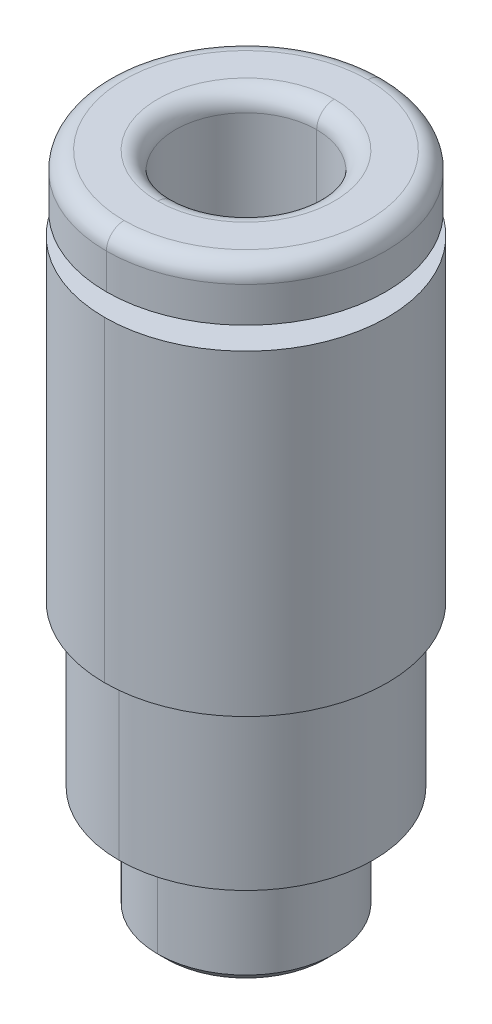
ISO-10303-21;
HEADER;
FILE_DESCRIPTION(('STEP AP214'),'2;1');
FILE_NAME('part.step','',(''),(''),'','','');
FILE_SCHEMA(('AUTOMOTIVE_DESIGN { 1 0 10303 214 1 1 1 1 }'));
ENDSEC;
DATA;
#1=APPLICATION_CONTEXT('core data for automotive mechanical design processes');
#2=APPLICATION_PROTOCOL_DEFINITION('international standard','automotive_design',2000,#1);
#3=PRODUCT_CONTEXT('',#1,'mechanical');
#4=PRODUCT('Part','Part','',(#3));
#5=PRODUCT_RELATED_PRODUCT_CATEGORY('part','',(#4));
#6=PRODUCT_DEFINITION_FORMATION('','',#4);
#7=PRODUCT_DEFINITION_CONTEXT('part definition',#1,'design');
#8=PRODUCT_DEFINITION('design','',#6,#7);
#9=PRODUCT_DEFINITION_SHAPE('','',#8);
#10=(LENGTH_UNIT() NAMED_UNIT(*) SI_UNIT(.MILLI.,.METRE.));
#11=(NAMED_UNIT(*) PLANE_ANGLE_UNIT() SI_UNIT($,.RADIAN.));
#12=(NAMED_UNIT(*) SI_UNIT($,.STERADIAN.) SOLID_ANGLE_UNIT());
#13=UNCERTAINTY_MEASURE_WITH_UNIT(LENGTH_MEASURE(1.E-05),#10,'distance_accuracy_value','');
#14=(GEOMETRIC_REPRESENTATION_CONTEXT(3) GLOBAL_UNCERTAINTY_ASSIGNED_CONTEXT((#13)) GLOBAL_UNIT_ASSIGNED_CONTEXT((#10,
#11,#12)) REPRESENTATION_CONTEXT('',''));
#15=CARTESIAN_POINT('',(0.,0.,0.));
#16=DIRECTION('',(0.,0.,1.));
#17=DIRECTION('',(1.,0.,0.));
#18=AXIS2_PLACEMENT_3D('',#15,#16,#17);
#19=CARTESIAN_POINT('',(0.,-18.7,0.));
#20=DIRECTION('',(0.,1.,0.));
#21=DIRECTION('',(0.,0.,1.));
#22=AXIS2_PLACEMENT_3D('',#19,#20,#21);
#23=CYLINDRICAL_SURFACE('',#22,1.1801584610165);
#24=CARTESIAN_POINT('',(0.,-18.7,0.));
#25=DIRECTION('',(0.,1.,0.));
#26=DIRECTION('',(0.,0.,1.));
#27=AXIS2_PLACEMENT_3D('',#24,#25,#26);
#28=CIRCLE('',#27,1.1801584610165);
#29=CARTESIAN_POINT('',(0.,-18.7,-1.1801584610165));
#30=VERTEX_POINT('',#29);
#31=CARTESIAN_POINT('',(0.,-18.7,1.1801584610165));
#32=VERTEX_POINT('',#31);
#33=EDGE_CURVE('E41',#30,#32,#28,.T.);
#34=ORIENTED_EDGE('',*,*,#33,.F.);
#35=DIRECTION('',(0.,1.,0.));
#36=VECTOR('',#35,1.);
#37=CARTESIAN_POINT('',(0.,-18.7,-1.1801584610165));
#38=LINE('',#37,#36);
#39=CARTESIAN_POINT('',(0.,-14.7,-1.1801584610165));
#40=VERTEX_POINT('',#39);
#41=EDGE_CURVE('E10',#30,#40,#38,.T.);
#42=ORIENTED_EDGE('',*,*,#41,.T.);
#43=CARTESIAN_POINT('',(0.,-14.7,0.));
#44=DIRECTION('',(0.,-1.,0.));
#45=DIRECTION('',(0.,0.,-1.));
#46=AXIS2_PLACEMENT_3D('',#43,#44,#45);
#47=CIRCLE('',#46,1.1801584610165);
#48=CARTESIAN_POINT('',(-1.02204720773144,-14.7,-0.590079230508252));
#49=VERTEX_POINT('',#48);
#50=EDGE_CURVE('E395',#49,#40,#47,.T.);
#51=ORIENTED_EDGE('',*,*,#50,.F.);
#52=CARTESIAN_POINT('',(0.,-14.7,0.));
#53=DIRECTION('',(0.,-1.,0.));
#54=DIRECTION('',(0.,0.,-1.));
#55=AXIS2_PLACEMENT_3D('',#52,#53,#54);
#56=CIRCLE('',#55,1.1801584610165);
#57=CARTESIAN_POINT('',(-1.02204720773144,-14.7,0.590079230508252));
#58=VERTEX_POINT('',#57);
#59=EDGE_CURVE('E274',#58,#49,#56,.T.);
#60=ORIENTED_EDGE('',*,*,#59,.F.);
#61=CARTESIAN_POINT('',(0.,-14.7,0.));
#62=DIRECTION('',(0.,-1.,0.));
#63=DIRECTION('',(0.,0.,-1.));
#64=AXIS2_PLACEMENT_3D('',#61,#62,#63);
#65=CIRCLE('',#64,1.1801584610165);
#66=CARTESIAN_POINT('',(0.,-14.7,1.1801584610165));
#67=VERTEX_POINT('',#66);
#68=EDGE_CURVE('E313',#67,#58,#65,.T.);
#69=ORIENTED_EDGE('',*,*,#68,.F.);
#70=DIRECTION('',(0.,1.,0.));
#71=VECTOR('',#70,1.);
#72=CARTESIAN_POINT('',(0.,-18.7,1.1801584610165));
#73=LINE('',#72,#71);
#74=EDGE_CURVE('E256',#32,#67,#73,.T.);
#75=ORIENTED_EDGE('',*,*,#74,.F.);
#76=EDGE_LOOP('',(#34,#42,#51,#60,#69,#75));
#77=FACE_BOUND('',#76,.T.);
#78=ADVANCED_FACE('F16',(#77),#23,.F.);
#79=CARTESIAN_POINT('',(0.,-0.5,0.));
#80=DIRECTION('',(0.,1.,0.));
#81=DIRECTION('',(0.,0.,1.));
#82=AXIS2_PLACEMENT_3D('',#79,#80,#81);
#83=TOROIDAL_SURFACE('',#82,2.5,0.5);
#84=CARTESIAN_POINT('',(0.,0.,0.));
#85=DIRECTION('',(0.,-1.,0.));
#86=DIRECTION('',(0.,0.,1.));
#87=AXIS2_PLACEMENT_3D('',#84,#85,#86);
#88=CIRCLE('',#87,2.5);
#89=CARTESIAN_POINT('',(0.,0.,-2.5));
#90=VERTEX_POINT('',#89);
#91=CARTESIAN_POINT('',(0.,0.,2.5));
#92=VERTEX_POINT('',#91);
#93=EDGE_CURVE('E349',#90,#92,#88,.T.);
#94=ORIENTED_EDGE('',*,*,#93,.F.);
#95=CARTESIAN_POINT('',(0.,-0.5,-2.5));
#96=DIRECTION('',(1.,0.,0.));
#97=DIRECTION('',(0.,0.,-1.));
#98=AXIS2_PLACEMENT_3D('',#95,#96,#97);
#99=CIRCLE('',#98,0.5);
#100=CARTESIAN_POINT('',(0.,-0.5,-2.));
#101=VERTEX_POINT('',#100);
#102=EDGE_CURVE('E27',#90,#101,#99,.T.);
#103=ORIENTED_EDGE('',*,*,#102,.T.);
#104=CARTESIAN_POINT('',(0.,-0.5,0.));
#105=DIRECTION('',(0.,1.,0.));
#106=DIRECTION('',(0.,0.,1.));
#107=AXIS2_PLACEMENT_3D('',#104,#105,#106);
#108=CIRCLE('',#107,2.);
#109=CARTESIAN_POINT('',(0.,-0.5,2.));
#110=VERTEX_POINT('',#109);
#111=EDGE_CURVE('E408',#110,#101,#108,.T.);
#112=ORIENTED_EDGE('',*,*,#111,.F.);
#113=CARTESIAN_POINT('',(0.,-0.5,2.5));
#114=DIRECTION('',(-1.,0.,0.));
#115=DIRECTION('',(0.,0.,1.));
#116=AXIS2_PLACEMENT_3D('',#113,#114,#115);
#117=CIRCLE('',#116,0.5);
#118=EDGE_CURVE('E283',#92,#110,#117,.T.);
#119=ORIENTED_EDGE('',*,*,#118,.F.);
#120=EDGE_LOOP('',(#94,#103,#112,#119));
#121=FACE_BOUND('',#120,.T.);
#122=ADVANCED_FACE('F687',(#121),#83,.T.);
#123=CARTESIAN_POINT('',(0.,-18.3568542494924,0.));
#124=DIRECTION('',(0.,1.,0.));
#125=DIRECTION('',(0.,0.,1.));
#126=AXIS2_PLACEMENT_3D('',#123,#124,#125);
#127=CYLINDRICAL_SURFACE('',#126,2.);
#128=CARTESIAN_POINT('',(0.,-12.7,0.));
#129=DIRECTION('',(0.,-1.,0.));
#130=DIRECTION('',(0.,0.,1.));
#131=AXIS2_PLACEMENT_3D('',#128,#129,#130);
#132=CIRCLE('',#131,2.);
#133=CARTESIAN_POINT('',(0.,-12.7,2.));
#134=VERTEX_POINT('',#133);
#135=CARTESIAN_POINT('',(0.,-12.7,-2.));
#136=VERTEX_POINT('',#135);
#137=EDGE_CURVE('E450',#134,#136,#132,.T.);
#138=ORIENTED_EDGE('',*,*,#137,.T.);
#139=DIRECTION('',(0.,1.,0.));
#140=VECTOR('',#139,1.);
#141=CARTESIAN_POINT('',(0.,-18.3568542494924,-2.));
#142=LINE('',#141,#140);
#143=EDGE_CURVE('E441',#136,#101,#142,.T.);
#144=ORIENTED_EDGE('',*,*,#143,.T.);
#145=CARTESIAN_POINT('',(0.,-0.5,0.));
#146=DIRECTION('',(0.,1.,0.));
#147=DIRECTION('',(0.,0.,1.));
#148=AXIS2_PLACEMENT_3D('',#145,#146,#147);
#149=CIRCLE('',#148,2.);
#150=EDGE_CURVE('E437',#101,#110,#149,.T.);
#151=ORIENTED_EDGE('',*,*,#150,.T.);
#152=DIRECTION('',(0.,1.,0.));
#153=VECTOR('',#152,1.);
#154=CARTESIAN_POINT('',(0.,-18.3568542494924,2.));
#155=LINE('',#154,#153);
#156=EDGE_CURVE('E343',#134,#110,#155,.T.);
#157=ORIENTED_EDGE('',*,*,#156,.F.);
#158=EDGE_LOOP('',(#138,#144,#151,#157));
#159=FACE_BOUND('',#158,.T.);
#160=ADVANCED_FACE('F651',(#159),#127,.F.);
#161=CARTESIAN_POINT('',(0.,-18.45,0.));
#162=DIRECTION('',(0.,1.,0.));
#163=DIRECTION('',(0.,0.,1.));
#164=AXIS2_PLACEMENT_3D('',#161,#162,#163);
#165=CONICAL_SURFACE('',#164,2.5,0.785398163397449);
#166=CARTESIAN_POINT('',(0.,-18.7,0.));
#167=DIRECTION('',(0.,-1.,0.));
#168=DIRECTION('',(0.,0.,-1.));
#169=AXIS2_PLACEMENT_3D('',#166,#167,#168);
#170=CIRCLE('',#169,2.25);
#171=CARTESIAN_POINT('',(0.,-18.7,-2.25));
#172=VERTEX_POINT('',#171);
#173=CARTESIAN_POINT('',(0.,-18.7,2.25));
#174=VERTEX_POINT('',#173);
#175=EDGE_CURVE('E273',#172,#174,#170,.T.);
#176=ORIENTED_EDGE('',*,*,#175,.F.);
#177=DIRECTION('',(0.,0.707106781186547,-0.707106781186548));
#178=VECTOR('',#177,1.);
#179=CARTESIAN_POINT('',(0.,-18.45,-2.5));
#180=LINE('',#179,#178);
#181=CARTESIAN_POINT('',(0.,-18.45,-2.5));
#182=VERTEX_POINT('',#181);
#183=EDGE_CURVE('E442',#172,#182,#180,.T.);
#184=ORIENTED_EDGE('',*,*,#183,.T.);
#185=CARTESIAN_POINT('',(0.,-18.45,0.));
#186=DIRECTION('',(0.,1.,0.));
#187=DIRECTION('',(0.,0.,-1.));
#188=AXIS2_PLACEMENT_3D('',#185,#186,#187);
#189=CIRCLE('',#188,2.5);
#190=CARTESIAN_POINT('',(0.,-18.45,2.5));
#191=VERTEX_POINT('',#190);
#192=EDGE_CURVE('E456',#191,#182,#189,.T.);
#193=ORIENTED_EDGE('',*,*,#192,.F.);
#194=DIRECTION('',(0.,0.707106781186547,0.707106781186548));
#195=VECTOR('',#194,1.);
#196=CARTESIAN_POINT('',(0.,-18.45,2.5));
#197=LINE('',#196,#195);
#198=EDGE_CURVE('E326',#174,#191,#197,.T.);
#199=ORIENTED_EDGE('',*,*,#198,.F.);
#200=EDGE_LOOP('',(#176,#184,#193,#199));
#201=FACE_BOUND('',#200,.T.);
#202=ADVANCED_FACE('F646',(#201),#165,.T.);
#203=CARTESIAN_POINT('',(0.,0.,0.));
#204=DIRECTION('',(0.,1.,0.));
#205=DIRECTION('',(0.,0.,1.));
#206=AXIS2_PLACEMENT_3D('',#203,#204,#205);
#207=CYLINDRICAL_SURFACE('',#206,2.5);
#208=ORIENTED_EDGE('',*,*,#192,.T.);
#209=DIRECTION('',(0.,1.,0.));
#210=VECTOR('',#209,1.);
#211=CARTESIAN_POINT('',(0.,0.,-2.5));
#212=LINE('',#211,#210);
#213=CARTESIAN_POINT('',(0.,-15.6,-2.5));
#214=VERTEX_POINT('',#213);
#215=EDGE_CURVE('E460',#182,#214,#212,.T.);
#216=ORIENTED_EDGE('',*,*,#215,.T.);
#217=CARTESIAN_POINT('',(0.,-15.6,0.));
#218=DIRECTION('',(0.,1.,0.));
#219=DIRECTION('',(0.,0.,1.));
#220=AXIS2_PLACEMENT_3D('',#217,#218,#219);
#221=CIRCLE('',#220,2.5);
#222=CARTESIAN_POINT('',(0.,-15.6,2.5));
#223=VERTEX_POINT('',#222);
#224=EDGE_CURVE('E100',#223,#214,#221,.T.);
#225=ORIENTED_EDGE('',*,*,#224,.F.);
#226=DIRECTION('',(0.,1.,0.));
#227=VECTOR('',#226,1.);
#228=CARTESIAN_POINT('',(0.,0.,2.5));
#229=LINE('',#228,#227);
#230=EDGE_CURVE('E113',#191,#223,#229,.T.);
#231=ORIENTED_EDGE('',*,*,#230,.F.);
#232=EDGE_LOOP('',(#208,#216,#225,#231));
#233=FACE_BOUND('',#232,.T.);
#234=ADVANCED_FACE('F650',(#233),#207,.T.);
#235=CARTESIAN_POINT('',(0.,-11.2,0.));
#236=DIRECTION('',(0.,1.,0.));
#237=DIRECTION('',(0.,0.,1.));
#238=AXIS2_PLACEMENT_3D('',#235,#236,#237);
#239=CONICAL_SURFACE('',#238,3.6,1.22173047639604);
#240=CARTESIAN_POINT('',(0.,-11.2,0.));
#241=DIRECTION('',(0.,1.,0.));
#242=DIRECTION('',(0.,0.,1.));
#243=AXIS2_PLACEMENT_3D('',#240,#241,#242);
#244=CIRCLE('',#243,3.6);
#245=CARTESIAN_POINT('',(0.,-11.2,3.6));
#246=VERTEX_POINT('',#245);
#247=CARTESIAN_POINT('',(0.,-11.2,-3.6));
#248=VERTEX_POINT('',#247);
#249=EDGE_CURVE('E370',#246,#248,#244,.T.);
#250=ORIENTED_EDGE('',*,*,#249,.T.);
#251=DIRECTION('',(0.,0.342020143325664,-0.93969262078591));
#252=VECTOR('',#251,1.);
#253=CARTESIAN_POINT('',(0.,-11.2,-3.6));
#254=LINE('',#253,#252);
#255=CARTESIAN_POINT('',(0.,-11.0544119062935,-4.));
#256=VERTEX_POINT('',#255);
#257=EDGE_CURVE('E366',#248,#256,#254,.T.);
#258=ORIENTED_EDGE('',*,*,#257,.T.);
#259=CARTESIAN_POINT('',(0.,-11.0544119062935,0.));
#260=DIRECTION('',(0.,1.,0.));
#261=DIRECTION('',(0.,0.,1.));
#262=AXIS2_PLACEMENT_3D('',#259,#260,#261);
#263=CIRCLE('',#262,4.);
#264=CARTESIAN_POINT('',(0.,-11.0544119062935,4.));
#265=VERTEX_POINT('',#264);
#266=EDGE_CURVE('E285',#265,#256,#263,.T.);
#267=ORIENTED_EDGE('',*,*,#266,.F.);
#268=DIRECTION('',(0.,0.342020143325664,0.93969262078591));
#269=VECTOR('',#268,1.);
#270=CARTESIAN_POINT('',(0.,-11.2,3.6));
#271=LINE('',#270,#269);
#272=EDGE_CURVE('E451',#246,#265,#271,.T.);
#273=ORIENTED_EDGE('',*,*,#272,.F.);
#274=EDGE_LOOP('',(#250,#258,#267,#273));
#275=FACE_BOUND('',#274,.T.);
#276=ADVANCED_FACE('F728',(#275),#239,.T.);
#277=CARTESIAN_POINT('',(0.,-25.7823376490863,0.));
#278=DIRECTION('',(0.,1.,0.));
#279=DIRECTION('',(0.,0.,1.));
#280=AXIS2_PLACEMENT_3D('',#277,#278,#279);
#281=CYLINDRICAL_SURFACE('',#280,3.6);
#282=CARTESIAN_POINT('',(0.,-15.6,0.));
#283=DIRECTION('',(0.,-1.,0.));
#284=DIRECTION('',(0.,0.,1.));
#285=AXIS2_PLACEMENT_3D('',#282,#283,#284);
#286=CIRCLE('',#285,3.6);
#287=CARTESIAN_POINT('',(0.,-15.6,-3.6));
#288=VERTEX_POINT('',#287);
#289=CARTESIAN_POINT('',(0.,-15.6,3.6));
#290=VERTEX_POINT('',#289);
#291=EDGE_CURVE('E291',#288,#290,#286,.T.);
#292=ORIENTED_EDGE('',*,*,#291,.F.);
#293=DIRECTION('',(0.,1.,0.));
#294=VECTOR('',#293,1.);
#295=CARTESIAN_POINT('',(0.,-25.7823376490863,-3.6));
#296=LINE('',#295,#294);
#297=EDGE_CURVE('E289',#288,#248,#296,.T.);
#298=ORIENTED_EDGE('',*,*,#297,.T.);
#299=ORIENTED_EDGE('',*,*,#249,.F.);
#300=DIRECTION('',(0.,1.,0.));
#301=VECTOR('',#300,1.);
#302=CARTESIAN_POINT('',(0.,-25.7823376490863,3.6));
#303=LINE('',#302,#301);
#304=EDGE_CURVE('E409',#290,#246,#303,.T.);
#305=ORIENTED_EDGE('',*,*,#304,.F.);
#306=EDGE_LOOP('',(#292,#298,#299,#305));
#307=FACE_BOUND('',#306,.T.);
#308=ADVANCED_FACE('F534',(#307),#281,.T.);
#309=CARTESIAN_POINT('',(0.,-22.5137084989847,0.));
#310=DIRECTION('',(0.,1.,0.));
#311=DIRECTION('',(0.,0.,1.));
#312=AXIS2_PLACEMENT_3D('',#309,#310,#311);
#313=CYLINDRICAL_SURFACE('',#312,4.);
#314=ORIENTED_EDGE('',*,*,#266,.T.);
#315=DIRECTION('',(0.,1.,0.));
#316=VECTOR('',#315,1.);
#317=CARTESIAN_POINT('',(0.,-22.5137084989847,-4.));
#318=LINE('',#317,#316);
#319=CARTESIAN_POINT('',(0.,-2.1,-4.));
#320=VERTEX_POINT('',#319);
#321=EDGE_CURVE('E290',#256,#320,#318,.T.);
#322=ORIENTED_EDGE('',*,*,#321,.T.);
#323=CARTESIAN_POINT('',(0.,-2.1,0.));
#324=DIRECTION('',(0.,1.,0.));
#325=DIRECTION('',(0.,0.,1.));
#326=AXIS2_PLACEMENT_3D('',#323,#324,#325);
#327=CIRCLE('',#326,4.);
#328=CARTESIAN_POINT('',(0.,-2.1,4.));
#329=VERTEX_POINT('',#328);
#330=EDGE_CURVE('E376',#329,#320,#327,.T.);
#331=ORIENTED_EDGE('',*,*,#330,.F.);
#332=DIRECTION('',(0.,1.,0.));
#333=VECTOR('',#332,1.);
#334=CARTESIAN_POINT('',(0.,-22.5137084989847,4.));
#335=LINE('',#334,#333);
#336=EDGE_CURVE('E371',#265,#329,#335,.T.);
#337=ORIENTED_EDGE('',*,*,#336,.F.);
#338=EDGE_LOOP('',(#314,#322,#331,#337));
#339=FACE_BOUND('',#338,.T.);
#340=ADVANCED_FACE('F528',(#339),#313,.T.);
#341=CARTESIAN_POINT('',(0.,-0.5,0.));
#342=DIRECTION('',(0.,1.,0.));
#343=DIRECTION('',(0.,0.,1.));
#344=AXIS2_PLACEMENT_3D('',#341,#342,#343);
#345=TOROIDAL_SURFACE('',#344,3.45,0.5);
#346=CARTESIAN_POINT('',(0.,-0.5,0.));
#347=DIRECTION('',(0.,1.,0.));
#348=DIRECTION('',(0.,0.,1.));
#349=AXIS2_PLACEMENT_3D('',#346,#347,#348);
#350=CIRCLE('',#349,3.95);
#351=CARTESIAN_POINT('',(0.,-0.5,3.95));
#352=VERTEX_POINT('',#351);
#353=CARTESIAN_POINT('',(0.,-0.5,-3.95));
#354=VERTEX_POINT('',#353);
#355=EDGE_CURVE('E396',#352,#354,#350,.T.);
#356=ORIENTED_EDGE('',*,*,#355,.T.);
#357=CARTESIAN_POINT('',(0.,-0.5,-3.45));
#358=DIRECTION('',(1.,0.,0.));
#359=DIRECTION('',(0.,0.,-1.));
#360=AXIS2_PLACEMENT_3D('',#357,#358,#359);
#361=CIRCLE('',#360,0.5);
#362=CARTESIAN_POINT('',(0.,0.,-3.45));
#363=VERTEX_POINT('',#362);
#364=EDGE_CURVE('E400',#354,#363,#361,.T.);
#365=ORIENTED_EDGE('',*,*,#364,.T.);
#366=CARTESIAN_POINT('',(0.,0.,0.));
#367=DIRECTION('',(0.,1.,0.));
#368=DIRECTION('',(0.,0.,1.));
#369=AXIS2_PLACEMENT_3D('',#366,#367,#368);
#370=CIRCLE('',#369,3.45);
#371=CARTESIAN_POINT('',(0.,0.,3.45));
#372=VERTEX_POINT('',#371);
#373=EDGE_CURVE('E331',#372,#363,#370,.T.);
#374=ORIENTED_EDGE('',*,*,#373,.F.);
#375=CARTESIAN_POINT('',(0.,-0.5,3.45));
#376=DIRECTION('',(-1.,0.,0.));
#377=DIRECTION('',(0.,0.,1.));
#378=AXIS2_PLACEMENT_3D('',#375,#376,#377);
#379=CIRCLE('',#378,0.5);
#380=EDGE_CURVE('E327',#352,#372,#379,.T.);
#381=ORIENTED_EDGE('',*,*,#380,.F.);
#382=EDGE_LOOP('',(#356,#365,#374,#381));
#383=FACE_BOUND('',#382,.T.);
#384=ADVANCED_FACE('F533',(#383),#345,.T.);
#385=CARTESIAN_POINT('',(0.,0.,0.));
#386=DIRECTION('',(0.,1.,0.));
#387=DIRECTION('',(0.,0.,1.));
#388=AXIS2_PLACEMENT_3D('',#385,#386,#387);
#389=CYLINDRICAL_SURFACE('',#388,3.95);
#390=CARTESIAN_POINT('',(0.,-1.5,0.));
#391=DIRECTION('',(0.,1.,0.));
#392=DIRECTION('',(0.,0.,1.));
#393=AXIS2_PLACEMENT_3D('',#390,#391,#392);
#394=CIRCLE('',#393,3.95);
#395=CARTESIAN_POINT('',(0.,-1.5,3.95));
#396=VERTEX_POINT('',#395);
#397=CARTESIAN_POINT('',(0.,-1.5,-3.95));
#398=VERTEX_POINT('',#397);
#399=EDGE_CURVE('E446',#396,#398,#394,.T.);
#400=ORIENTED_EDGE('',*,*,#399,.T.);
#401=DIRECTION('',(0.,1.,0.));
#402=VECTOR('',#401,1.);
#403=CARTESIAN_POINT('',(0.,0.,-3.95));
#404=LINE('',#403,#402);
#405=EDGE_CURVE('E471',#398,#354,#404,.T.);
#406=ORIENTED_EDGE('',*,*,#405,.T.);
#407=ORIENTED_EDGE('',*,*,#355,.F.);
#408=DIRECTION('',(0.,1.,0.));
#409=VECTOR('',#408,1.);
#410=CARTESIAN_POINT('',(0.,0.,3.95));
#411=LINE('',#410,#409);
#412=EDGE_CURVE('E304',#396,#352,#411,.T.);
#413=ORIENTED_EDGE('',*,*,#412,.F.);
#414=EDGE_LOOP('',(#400,#406,#407,#413));
#415=FACE_BOUND('',#414,.T.);
#416=ADVANCED_FACE('F557',(#415),#389,.T.);
#417=CARTESIAN_POINT('',(0.,0.,0.));
#418=DIRECTION('',(0.,1.,0.));
#419=DIRECTION('',(0.,0.,1.));
#420=AXIS2_PLACEMENT_3D('',#417,#418,#419);
#421=CYLINDRICAL_SURFACE('',#420,2.2);
#422=CARTESIAN_POINT('',(0.,-2.1,0.));
#423=DIRECTION('',(0.,-1.,0.));
#424=DIRECTION('',(0.,0.,1.));
#425=AXIS2_PLACEMENT_3D('',#422,#423,#424);
#426=CIRCLE('',#425,2.2);
#427=CARTESIAN_POINT('',(0.,-2.1,-2.2));
#428=VERTEX_POINT('',#427);
#429=CARTESIAN_POINT('',(0.,-2.1,2.2));
#430=VERTEX_POINT('',#429);
#431=EDGE_CURVE('E413',#428,#430,#426,.T.);
#432=ORIENTED_EDGE('',*,*,#431,.F.);
#433=DIRECTION('',(0.,1.,0.));
#434=VECTOR('',#433,1.);
#435=CARTESIAN_POINT('',(0.,0.,-2.2));
#436=LINE('',#435,#434);
#437=CARTESIAN_POINT('',(0.,-1.5,-2.2));
#438=VERTEX_POINT('',#437);
#439=EDGE_CURVE('E423',#428,#438,#436,.T.);
#440=ORIENTED_EDGE('',*,*,#439,.T.);
#441=CARTESIAN_POINT('',(0.,-1.5,0.));
#442=DIRECTION('',(0.,1.,0.));
#443=DIRECTION('',(0.,0.,1.));
#444=AXIS2_PLACEMENT_3D('',#441,#442,#443);
#445=CIRCLE('',#444,2.2);
#446=CARTESIAN_POINT('',(0.,-1.5,2.2));
#447=VERTEX_POINT('',#446);
#448=EDGE_CURVE('E357',#447,#438,#445,.T.);
#449=ORIENTED_EDGE('',*,*,#448,.F.);
#450=DIRECTION('',(0.,1.,0.));
#451=VECTOR('',#450,1.);
#452=CARTESIAN_POINT('',(0.,0.,2.2));
#453=LINE('',#452,#451);
#454=EDGE_CURVE('E361',#430,#447,#453,.T.);
#455=ORIENTED_EDGE('',*,*,#454,.F.);
#456=EDGE_LOOP('',(#432,#440,#449,#455));
#457=FACE_BOUND('',#456,.T.);
#458=ADVANCED_FACE('F553',(#457),#421,.T.);
#459=CARTESIAN_POINT('',(0.721687836487033,-14.7,1.25));
#460=DIRECTION('',(0.,-1.,0.));
#461=DIRECTION('',(0.,0.,-1.));
#462=AXIS2_PLACEMENT_3D('',#459,#460,#461);
#463=PLANE('',#462);
#464=DIRECTION('',(-1.,0.,0.));
#465=VECTOR('',#464,1.);
#466=CARTESIAN_POINT('',(0.721687836487032,-14.7,-1.1801584610165));
#467=LINE('',#466,#465);
#468=CARTESIAN_POINT('',(0.681364805154293,-14.7,-1.1801584610165));
#469=VERTEX_POINT('',#468);
#470=EDGE_CURVE('E418',#469,#40,#467,.T.);
#471=ORIENTED_EDGE('',*,*,#470,.T.);
#472=CARTESIAN_POINT('',(0.,-14.7,0.));
#473=DIRECTION('',(0.,-1.,0.));
#474=DIRECTION('',(0.,0.,-1.));
#475=AXIS2_PLACEMENT_3D('',#472,#473,#474);
#476=CIRCLE('',#475,1.1801584610165);
#477=CARTESIAN_POINT('',(1.02204720773144,-14.7,-0.590079230508253));
#478=VERTEX_POINT('',#477);
#479=EDGE_CURVE('E414',#40,#478,#476,.T.);
#480=ORIENTED_EDGE('',*,*,#479,.T.);
#481=DIRECTION('',(-0.5,0.,-0.866025403784439));
#482=VECTOR('',#481,1.);
#483=CARTESIAN_POINT('',(1.38289112597496,-14.7,0.0349207694917474));
#484=LINE('',#483,#482);
#485=EDGE_CURVE('E419',#478,#469,#484,.T.);
#486=ORIENTED_EDGE('',*,*,#485,.T.);
#487=EDGE_LOOP('',(#471,#480,#486));
#488=FACE_BOUND('',#487,.T.);
#489=ADVANCED_FACE('F546',(#488),#463,.F.);
#490=CARTESIAN_POINT('',(0.721687836487033,-14.7,1.25));
#491=DIRECTION('',(0.,-1.,0.));
#492=DIRECTION('',(0.,0.,-1.));
#493=AXIS2_PLACEMENT_3D('',#490,#491,#492);
#494=PLANE('',#493);
#495=DIRECTION('',(-0.5,0.,-0.866025403784439));
#496=VECTOR('',#495,1.);
#497=CARTESIAN_POINT('',(1.38289112597496,-14.7,0.0349207694917474));
#498=LINE('',#497,#496);
#499=CARTESIAN_POINT('',(1.36272961030859,-14.7,0.));
#500=VERTEX_POINT('',#499);
#501=EDGE_CURVE('E248',#500,#478,#498,.T.);
#502=ORIENTED_EDGE('',*,*,#501,.T.);
#503=CARTESIAN_POINT('',(0.,-14.7,0.));
#504=DIRECTION('',(0.,-1.,0.));
#505=DIRECTION('',(0.,0.,-1.));
#506=AXIS2_PLACEMENT_3D('',#503,#504,#505);
#507=CIRCLE('',#506,1.1801584610165);
#508=CARTESIAN_POINT('',(1.02204720773144,-14.7,0.590079230508252));
#509=VERTEX_POINT('',#508);
#510=EDGE_CURVE('E244',#478,#509,#507,.T.);
#511=ORIENTED_EDGE('',*,*,#510,.T.);
#512=DIRECTION('',(0.5,0.,-0.866025403784439));
#513=VECTOR('',#512,1.);
#514=CARTESIAN_POINT('',(0.661203289487924,-14.7,1.21507923050825));
#515=LINE('',#514,#513);
#516=EDGE_CURVE('E233',#509,#500,#515,.T.);
#517=ORIENTED_EDGE('',*,*,#516,.T.);
#518=EDGE_LOOP('',(#502,#511,#517));
#519=FACE_BOUND('',#518,.T.);
#520=ADVANCED_FACE('F247',(#519),#494,.F.);
#521=CARTESIAN_POINT('',(0.721687836487033,-14.7,1.25));
#522=DIRECTION('',(0.,-1.,0.));
#523=DIRECTION('',(0.,0.,-1.));
#524=AXIS2_PLACEMENT_3D('',#521,#522,#523);
#525=PLANE('',#524);
#526=DIRECTION('',(0.5,0.,-0.866025403784439));
#527=VECTOR('',#526,1.);
#528=CARTESIAN_POINT('',(0.661203289487924,-14.7,1.21507923050825));
#529=LINE('',#528,#527);
#530=CARTESIAN_POINT('',(0.681364805154294,-14.7,1.1801584610165));
#531=VERTEX_POINT('',#530);
#532=EDGE_CURVE('E221',#531,#509,#529,.T.);
#533=ORIENTED_EDGE('',*,*,#532,.T.);
#534=CARTESIAN_POINT('',(0.,-14.7,0.));
#535=DIRECTION('',(0.,1.,0.));
#536=DIRECTION('',(0.,0.,1.));
#537=AXIS2_PLACEMENT_3D('',#534,#535,#536);
#538=CIRCLE('',#537,1.1801584610165);
#539=EDGE_CURVE('E225',#67,#509,#538,.T.);
#540=ORIENTED_EDGE('',*,*,#539,.F.);
#541=DIRECTION('',(1.,0.,0.));
#542=VECTOR('',#541,1.);
#543=CARTESIAN_POINT('',(-0.721687836487033,-14.7,1.1801584610165));
#544=LINE('',#543,#542);
#545=EDGE_CURVE('E228',#67,#531,#544,.T.);
#546=ORIENTED_EDGE('',*,*,#545,.T.);
#547=EDGE_LOOP('',(#533,#540,#546));
#548=FACE_BOUND('',#547,.T.);
#549=ADVANCED_FACE('F223',(#548),#525,.F.);
#550=CARTESIAN_POINT('',(0.721687836487033,-14.7,1.25));
#551=DIRECTION('',(0.,-1.,0.));
#552=DIRECTION('',(0.,0.,-1.));
#553=AXIS2_PLACEMENT_3D('',#550,#551,#552);
#554=PLANE('',#553);
#555=DIRECTION('',(1.,0.,0.));
#556=VECTOR('',#555,1.);
#557=CARTESIAN_POINT('',(-0.721687836487033,-14.7,1.1801584610165));
#558=LINE('',#557,#556);
#559=CARTESIAN_POINT('',(-0.681364805154294,-14.7,1.1801584610165));
#560=VERTEX_POINT('',#559);
#561=EDGE_CURVE('E312',#560,#67,#558,.T.);
#562=ORIENTED_EDGE('',*,*,#561,.T.);
#563=ORIENTED_EDGE('',*,*,#68,.T.);
#564=DIRECTION('',(0.5,0.,0.866025403784439));
#565=VECTOR('',#564,1.);
#566=CARTESIAN_POINT('',(-1.38289112597496,-14.7,-0.0349207694917476));
#567=LINE('',#566,#565);
#568=EDGE_CURVE('E317',#58,#560,#567,.T.);
#569=ORIENTED_EDGE('',*,*,#568,.T.);
#570=EDGE_LOOP('',(#562,#563,#569));
#571=FACE_BOUND('',#570,.T.);
#572=ADVANCED_FACE('F593',(#571),#554,.F.);
#573=CARTESIAN_POINT('',(0.721687836487033,-14.7,1.25));
#574=DIRECTION('',(0.,-1.,0.));
#575=DIRECTION('',(0.,0.,-1.));
#576=AXIS2_PLACEMENT_3D('',#573,#574,#575);
#577=PLANE('',#576);
#578=DIRECTION('',(0.5,0.,0.866025403784439));
#579=VECTOR('',#578,1.);
#580=CARTESIAN_POINT('',(-1.38289112597496,-14.7,-0.0349207694917476));
#581=LINE('',#580,#579);
#582=CARTESIAN_POINT('',(-1.36272961030859,-14.7,0.));
#583=VERTEX_POINT('',#582);
#584=EDGE_CURVE('E278',#583,#58,#581,.T.);
#585=ORIENTED_EDGE('',*,*,#584,.T.);
#586=ORIENTED_EDGE('',*,*,#59,.T.);
#587=DIRECTION('',(-0.5,0.,0.866025403784439));
#588=VECTOR('',#587,1.);
#589=CARTESIAN_POINT('',(-0.661203289487924,-14.7,-1.21507923050825));
#590=LINE('',#589,#588);
#591=EDGE_CURVE('E279',#49,#583,#590,.T.);
#592=ORIENTED_EDGE('',*,*,#591,.T.);
#593=EDGE_LOOP('',(#585,#586,#592));
#594=FACE_BOUND('',#593,.T.);
#595=ADVANCED_FACE('F604',(#594),#577,.F.);
#596=CARTESIAN_POINT('',(0.,0.,0.));
#597=DIRECTION('',(0.,1.,0.));
#598=DIRECTION('',(0.,0.,1.));
#599=AXIS2_PLACEMENT_3D('',#596,#597,#598);
#600=CYLINDRICAL_SURFACE('',#599,2.2);
#601=ORIENTED_EDGE('',*,*,#439,.F.);
#602=CARTESIAN_POINT('',(0.,-2.1,0.));
#603=DIRECTION('',(0.,-1.,0.));
#604=DIRECTION('',(0.,0.,1.));
#605=AXIS2_PLACEMENT_3D('',#602,#603,#604);
#606=CIRCLE('',#605,2.2);
#607=EDGE_CURVE('E390',#430,#428,#606,.T.);
#608=ORIENTED_EDGE('',*,*,#607,.F.);
#609=ORIENTED_EDGE('',*,*,#454,.T.);
#610=CARTESIAN_POINT('',(0.,-1.5,0.));
#611=DIRECTION('',(0.,1.,0.));
#612=DIRECTION('',(0.,0.,1.));
#613=AXIS2_PLACEMENT_3D('',#610,#611,#612);
#614=CIRCLE('',#613,2.2);
#615=EDGE_CURVE('E338',#438,#447,#614,.T.);
#616=ORIENTED_EDGE('',*,*,#615,.F.);
#617=EDGE_LOOP('',(#601,#608,#609,#616));
#618=FACE_BOUND('',#617,.T.);
#619=ADVANCED_FACE('F600',(#618),#600,.T.);
#620=CARTESIAN_POINT('',(-3.95,-1.5,0.));
#621=DIRECTION('',(0.,-1.,0.));
#622=DIRECTION('',(0.,0.,-1.));
#623=AXIS2_PLACEMENT_3D('',#620,#621,#622);
#624=PLANE('',#623);
#625=ORIENTED_EDGE('',*,*,#399,.F.);
#626=CARTESIAN_POINT('',(0.,-1.5,0.));
#627=DIRECTION('',(0.,1.,0.));
#628=DIRECTION('',(0.,0.,1.));
#629=AXIS2_PLACEMENT_3D('',#626,#627,#628);
#630=CIRCLE('',#629,3.95);
#631=EDGE_CURVE('E308',#398,#396,#630,.T.);
#632=ORIENTED_EDGE('',*,*,#631,.F.);
#633=EDGE_LOOP('',(#625,#632));
#634=FACE_BOUND('',#633,.T.);
#635=ORIENTED_EDGE('',*,*,#448,.T.);
#636=ORIENTED_EDGE('',*,*,#615,.T.);
#637=EDGE_LOOP('',(#635,#636));
#638=FACE_BOUND('',#637,.T.);
#639=ADVANCED_FACE('F570',(#634,#638),#624,.T.);
#640=CARTESIAN_POINT('',(0.,0.,0.));
#641=DIRECTION('',(0.,1.,0.));
#642=DIRECTION('',(0.,0.,1.));
#643=AXIS2_PLACEMENT_3D('',#640,#641,#642);
#644=CYLINDRICAL_SURFACE('',#643,3.95);
#645=ORIENTED_EDGE('',*,*,#405,.F.);
#646=ORIENTED_EDGE('',*,*,#631,.T.);
#647=ORIENTED_EDGE('',*,*,#412,.T.);
#648=CARTESIAN_POINT('',(0.,-0.5,0.));
#649=DIRECTION('',(0.,1.,0.));
#650=DIRECTION('',(0.,0.,1.));
#651=AXIS2_PLACEMENT_3D('',#648,#649,#650);
#652=CIRCLE('',#651,3.95);
#653=EDGE_CURVE('E309',#354,#352,#652,.T.);
#654=ORIENTED_EDGE('',*,*,#653,.F.);
#655=EDGE_LOOP('',(#645,#646,#647,#654));
#656=FACE_BOUND('',#655,.T.);
#657=ADVANCED_FACE('F565',(#656),#644,.T.);
#658=CARTESIAN_POINT('',(0.,-0.5,0.));
#659=DIRECTION('',(0.,1.,0.));
#660=DIRECTION('',(0.,0.,1.));
#661=AXIS2_PLACEMENT_3D('',#658,#659,#660);
#662=TOROIDAL_SURFACE('',#661,3.45,0.5);
#663=ORIENTED_EDGE('',*,*,#364,.F.);
#664=ORIENTED_EDGE('',*,*,#653,.T.);
#665=ORIENTED_EDGE('',*,*,#380,.T.);
#666=CARTESIAN_POINT('',(0.,0.,0.));
#667=DIRECTION('',(0.,1.,0.));
#668=DIRECTION('',(0.,0.,1.));
#669=AXIS2_PLACEMENT_3D('',#666,#667,#668);
#670=CIRCLE('',#669,3.45);
#671=EDGE_CURVE('E348',#363,#372,#670,.T.);
#672=ORIENTED_EDGE('',*,*,#671,.F.);
#673=EDGE_LOOP('',(#663,#664,#665,#672));
#674=FACE_BOUND('',#673,.T.);
#675=ADVANCED_FACE('F569',(#674),#662,.T.);
#676=CARTESIAN_POINT('',(0.,0.,0.));
#677=DIRECTION('',(0.,1.,0.));
#678=DIRECTION('',(1.,0.,0.));
#679=AXIS2_PLACEMENT_3D('',#676,#677,#678);
#680=PLANE('',#679);
#681=ORIENTED_EDGE('',*,*,#373,.T.);
#682=ORIENTED_EDGE('',*,*,#671,.T.);
#683=EDGE_LOOP('',(#681,#682));
#684=FACE_BOUND('',#683,.T.);
#685=CARTESIAN_POINT('',(0.,0.,0.));
#686=DIRECTION('',(0.,-1.,0.));
#687=DIRECTION('',(0.,0.,1.));
#688=AXIS2_PLACEMENT_3D('',#685,#686,#687);
#689=CIRCLE('',#688,2.5);
#690=EDGE_CURVE('E344',#92,#90,#689,.T.);
#691=ORIENTED_EDGE('',*,*,#690,.T.);
#692=ORIENTED_EDGE('',*,*,#93,.T.);
#693=EDGE_LOOP('',(#691,#692));
#694=FACE_BOUND('',#693,.T.);
#695=ADVANCED_FACE('F739',(#684,#694),#680,.T.);
#696=CARTESIAN_POINT('',(0.,-22.5137084989847,0.));
#697=DIRECTION('',(0.,1.,0.));
#698=DIRECTION('',(0.,0.,1.));
#699=AXIS2_PLACEMENT_3D('',#696,#697,#698);
#700=CYLINDRICAL_SURFACE('',#699,4.);
#701=ORIENTED_EDGE('',*,*,#321,.F.);
#702=CARTESIAN_POINT('',(0.,-11.0544119062935,0.));
#703=DIRECTION('',(0.,1.,0.));
#704=DIRECTION('',(0.,0.,1.));
#705=AXIS2_PLACEMENT_3D('',#702,#703,#704);
#706=CIRCLE('',#705,4.);
#707=EDGE_CURVE('E375',#256,#265,#706,.T.);
#708=ORIENTED_EDGE('',*,*,#707,.T.);
#709=ORIENTED_EDGE('',*,*,#336,.T.);
#710=CARTESIAN_POINT('',(0.,-2.1,0.));
#711=DIRECTION('',(0.,1.,0.));
#712=DIRECTION('',(0.,0.,1.));
#713=AXIS2_PLACEMENT_3D('',#710,#711,#712);
#714=CIRCLE('',#713,4.);
#715=EDGE_CURVE('E386',#320,#329,#714,.T.);
#716=ORIENTED_EDGE('',*,*,#715,.F.);
#717=EDGE_LOOP('',(#701,#708,#709,#716));
#718=FACE_BOUND('',#717,.T.);
#719=ADVANCED_FACE('F802',(#718),#700,.T.);
#720=CARTESIAN_POINT('',(0.,-2.1,0.));
#721=DIRECTION('',(0.,1.,0.));
#722=DIRECTION('',(1.,0.,0.));
#723=AXIS2_PLACEMENT_3D('',#720,#721,#722);
#724=PLANE('',#723);
#725=ORIENTED_EDGE('',*,*,#330,.T.);
#726=ORIENTED_EDGE('',*,*,#715,.T.);
#727=EDGE_LOOP('',(#725,#726));
#728=FACE_BOUND('',#727,.T.);
#729=ORIENTED_EDGE('',*,*,#607,.T.);
#730=ORIENTED_EDGE('',*,*,#431,.T.);
#731=EDGE_LOOP('',(#729,#730));
#732=FACE_BOUND('',#731,.T.);
#733=ADVANCED_FACE('F664',(#728,#732),#724,.T.);
#734=CARTESIAN_POINT('',(0.,-25.7823376490863,0.));
#735=DIRECTION('',(0.,1.,0.));
#736=DIRECTION('',(0.,0.,1.));
#737=AXIS2_PLACEMENT_3D('',#734,#735,#736);
#738=CYLINDRICAL_SURFACE('',#737,3.6);
#739=ORIENTED_EDGE('',*,*,#297,.F.);
#740=CARTESIAN_POINT('',(0.,-15.6,0.));
#741=DIRECTION('',(0.,-1.,0.));
#742=DIRECTION('',(0.,0.,1.));
#743=AXIS2_PLACEMENT_3D('',#740,#741,#742);
#744=CIRCLE('',#743,3.6);
#745=EDGE_CURVE('E294',#290,#288,#744,.T.);
#746=ORIENTED_EDGE('',*,*,#745,.F.);
#747=ORIENTED_EDGE('',*,*,#304,.T.);
#748=CARTESIAN_POINT('',(0.,-11.2,0.));
#749=DIRECTION('',(0.,1.,0.));
#750=DIRECTION('',(0.,0.,1.));
#751=AXIS2_PLACEMENT_3D('',#748,#749,#750);
#752=CIRCLE('',#751,3.6);
#753=EDGE_CURVE('E20',#248,#246,#752,.T.);
#754=ORIENTED_EDGE('',*,*,#753,.F.);
#755=EDGE_LOOP('',(#739,#746,#747,#754));
#756=FACE_BOUND('',#755,.T.);
#757=ADVANCED_FACE('F659',(#756),#738,.T.);
#758=CARTESIAN_POINT('',(0.,-15.6,0.));
#759=DIRECTION('',(0.,1.,0.));
#760=DIRECTION('',(1.,0.,0.));
#761=AXIS2_PLACEMENT_3D('',#758,#759,#760);
#762=PLANE('',#761);
#763=ORIENTED_EDGE('',*,*,#745,.T.);
#764=ORIENTED_EDGE('',*,*,#291,.T.);
#765=EDGE_LOOP('',(#763,#764));
#766=FACE_BOUND('',#765,.T.);
#767=ORIENTED_EDGE('',*,*,#224,.T.);
#768=CARTESIAN_POINT('',(0.,-15.6,0.));
#769=DIRECTION('',(0.,1.,0.));
#770=DIRECTION('',(0.,0.,1.));
#771=AXIS2_PLACEMENT_3D('',#768,#769,#770);
#772=CIRCLE('',#771,2.5);
#773=EDGE_CURVE('E318',#214,#223,#772,.T.);
#774=ORIENTED_EDGE('',*,*,#773,.T.);
#775=EDGE_LOOP('',(#767,#774));
#776=FACE_BOUND('',#775,.T.);
#777=ADVANCED_FACE('F663',(#766,#776),#762,.F.);
#778=CARTESIAN_POINT('',(0.,-11.2,0.));
#779=DIRECTION('',(0.,1.,0.));
#780=DIRECTION('',(0.,0.,1.));
#781=AXIS2_PLACEMENT_3D('',#778,#779,#780);
#782=CONICAL_SURFACE('',#781,3.6,1.22173047639604);
#783=ORIENTED_EDGE('',*,*,#257,.F.);
#784=ORIENTED_EDGE('',*,*,#753,.T.);
#785=ORIENTED_EDGE('',*,*,#272,.T.);
#786=ORIENTED_EDGE('',*,*,#707,.F.);
#787=EDGE_LOOP('',(#783,#784,#785,#786));
#788=FACE_BOUND('',#787,.T.);
#789=ADVANCED_FACE('F677',(#788),#782,.T.);
#790=CARTESIAN_POINT('',(0.,0.,0.));
#791=DIRECTION('',(0.,1.,0.));
#792=DIRECTION('',(0.,0.,1.));
#793=AXIS2_PLACEMENT_3D('',#790,#791,#792);
#794=CYLINDRICAL_SURFACE('',#793,2.5);
#795=ORIENTED_EDGE('',*,*,#215,.F.);
#796=CARTESIAN_POINT('',(0.,-18.45,0.));
#797=DIRECTION('',(0.,1.,0.));
#798=DIRECTION('',(0.,0.,-1.));
#799=AXIS2_PLACEMENT_3D('',#796,#797,#798);
#800=CIRCLE('',#799,2.5);
#801=EDGE_CURVE('E455',#182,#191,#800,.T.);
#802=ORIENTED_EDGE('',*,*,#801,.T.);
#803=ORIENTED_EDGE('',*,*,#230,.T.);
#804=ORIENTED_EDGE('',*,*,#773,.F.);
#805=EDGE_LOOP('',(#795,#802,#803,#804));
#806=FACE_BOUND('',#805,.T.);
#807=ADVANCED_FACE('F672',(#806),#794,.T.);
#808=CARTESIAN_POINT('',(-2.5,-18.7,0.));
#809=DIRECTION('',(0.,-1.,0.));
#810=DIRECTION('',(0.,0.,-1.));
#811=AXIS2_PLACEMENT_3D('',#808,#809,#810);
#812=PLANE('',#811);
#813=CARTESIAN_POINT('',(0.,-18.7,0.));
#814=DIRECTION('',(0.,-1.,0.));
#815=DIRECTION('',(0.,0.,-1.));
#816=AXIS2_PLACEMENT_3D('',#813,#814,#815);
#817=CIRCLE('',#816,2.25);
#818=EDGE_CURVE('E270',#174,#172,#817,.T.);
#819=ORIENTED_EDGE('',*,*,#818,.T.);
#820=ORIENTED_EDGE('',*,*,#175,.T.);
#821=EDGE_LOOP('',(#819,#820));
#822=FACE_BOUND('',#821,.T.);
#823=CARTESIAN_POINT('',(0.,-18.7,0.));
#824=DIRECTION('',(0.,1.,0.));
#825=DIRECTION('',(0.,0.,1.));
#826=AXIS2_PLACEMENT_3D('',#823,#824,#825);
#827=CIRCLE('',#826,1.1801584610165);
#828=EDGE_CURVE('E298',#32,#30,#827,.T.);
#829=ORIENTED_EDGE('',*,*,#828,.T.);
#830=ORIENTED_EDGE('',*,*,#33,.T.);
#831=EDGE_LOOP('',(#829,#830));
#832=FACE_BOUND('',#831,.T.);
#833=ADVANCED_FACE('F676',(#822,#832),#812,.T.);
#834=CARTESIAN_POINT('',(0.,-18.45,0.));
#835=DIRECTION('',(0.,1.,0.));
#836=DIRECTION('',(0.,0.,1.));
#837=AXIS2_PLACEMENT_3D('',#834,#835,#836);
#838=CONICAL_SURFACE('',#837,2.5,0.785398163397449);
#839=ORIENTED_EDGE('',*,*,#183,.F.);
#840=ORIENTED_EDGE('',*,*,#818,.F.);
#841=ORIENTED_EDGE('',*,*,#198,.T.);
#842=ORIENTED_EDGE('',*,*,#801,.F.);
#843=EDGE_LOOP('',(#839,#840,#841,#842));
#844=FACE_BOUND('',#843,.T.);
#845=ADVANCED_FACE('F18',(#844),#838,.T.);
#846=CARTESIAN_POINT('',(0.,-18.3568542494924,0.));
#847=DIRECTION('',(0.,1.,0.));
#848=DIRECTION('',(0.,0.,1.));
#849=AXIS2_PLACEMENT_3D('',#846,#847,#848);
#850=CYLINDRICAL_SURFACE('',#849,2.);
#851=ORIENTED_EDGE('',*,*,#143,.F.);
#852=CARTESIAN_POINT('',(0.,-12.7,0.));
#853=DIRECTION('',(0.,-1.,0.));
#854=DIRECTION('',(0.,0.,1.));
#855=AXIS2_PLACEMENT_3D('',#852,#853,#854);
#856=CIRCLE('',#855,2.);
#857=EDGE_CURVE('E339',#136,#134,#856,.T.);
#858=ORIENTED_EDGE('',*,*,#857,.T.);
#859=ORIENTED_EDGE('',*,*,#156,.T.);
#860=ORIENTED_EDGE('',*,*,#111,.T.);
#861=EDGE_LOOP('',(#851,#858,#859,#860));
#862=FACE_BOUND('',#861,.T.);
#863=ADVANCED_FACE('F624',(#862),#850,.F.);
#864=CARTESIAN_POINT('',(0.,-12.7,0.));
#865=DIRECTION('',(0.,1.,0.));
#866=DIRECTION('',(1.,0.,0.));
#867=AXIS2_PLACEMENT_3D('',#864,#865,#866);
#868=PLANE('',#867);
#869=ORIENTED_EDGE('',*,*,#137,.F.);
#870=ORIENTED_EDGE('',*,*,#857,.F.);
#871=EDGE_LOOP('',(#869,#870));
#872=FACE_BOUND('',#871,.T.);
#873=DIRECTION('',(0.5,0.,-0.866025403784439));
#874=VECTOR('',#873,1.);
#875=CARTESIAN_POINT('',(0.721687836487033,-12.7,1.25));
#876=LINE('',#875,#874);
#877=CARTESIAN_POINT('',(0.721687836487033,-12.7,1.25));
#878=VERTEX_POINT('',#877);
#879=CARTESIAN_POINT('',(1.44337567297406,-12.7,0.));
#880=VERTEX_POINT('',#879);
#881=EDGE_CURVE('E280',#878,#880,#876,.T.);
#882=ORIENTED_EDGE('',*,*,#881,.F.);
#883=DIRECTION('',(1.,0.,0.));
#884=VECTOR('',#883,1.);
#885=CARTESIAN_POINT('',(-0.721687836487033,-12.7,1.25));
#886=LINE('',#885,#884);
#887=CARTESIAN_POINT('',(-0.721687836487033,-12.7,1.25));
#888=VERTEX_POINT('',#887);
#889=EDGE_CURVE('E350',#888,#878,#886,.T.);
#890=ORIENTED_EDGE('',*,*,#889,.F.);
#891=DIRECTION('',(0.5,0.,0.866025403784439));
#892=VECTOR('',#891,1.);
#893=CARTESIAN_POINT('',(-1.44337567297406,-12.7,0.));
#894=LINE('',#893,#892);
#895=CARTESIAN_POINT('',(-1.44337567297406,-12.7,0.));
#896=VERTEX_POINT('',#895);
#897=EDGE_CURVE('E365',#896,#888,#894,.T.);
#898=ORIENTED_EDGE('',*,*,#897,.F.);
#899=DIRECTION('',(-0.5,0.,0.866025403784439));
#900=VECTOR('',#899,1.);
#901=CARTESIAN_POINT('',(-0.721687836487033,-12.7,-1.25));
#902=LINE('',#901,#900);
#903=CARTESIAN_POINT('',(-0.721687836487033,-12.7,-1.25));
#904=VERTEX_POINT('',#903);
#905=EDGE_CURVE('E384',#904,#896,#902,.T.);
#906=ORIENTED_EDGE('',*,*,#905,.F.);
#907=DIRECTION('',(-1.,0.,0.));
#908=VECTOR('',#907,1.);
#909=CARTESIAN_POINT('',(0.721687836487032,-12.7,-1.25));
#910=LINE('',#909,#908);
#911=CARTESIAN_POINT('',(0.721687836487032,-12.7,-1.25));
#912=VERTEX_POINT('',#911);
#913=EDGE_CURVE('E385',#912,#904,#910,.T.);
#914=ORIENTED_EDGE('',*,*,#913,.F.);
#915=DIRECTION('',(-0.5,0.,-0.866025403784439));
#916=VECTOR('',#915,1.);
#917=CARTESIAN_POINT('',(1.44337567297406,-12.7,0.));
#918=LINE('',#917,#916);
#919=EDGE_CURVE('E299',#880,#912,#918,.T.);
#920=ORIENTED_EDGE('',*,*,#919,.F.);
#921=EDGE_LOOP('',(#882,#890,#898,#906,#914,#920));
#922=FACE_BOUND('',#921,.T.);
#923=ADVANCED_FACE('F628',(#872,#922),#868,.T.);
#924=CARTESIAN_POINT('',(0.,-0.5,0.));
#925=DIRECTION('',(0.,1.,0.));
#926=DIRECTION('',(0.,0.,1.));
#927=AXIS2_PLACEMENT_3D('',#924,#925,#926);
#928=TOROIDAL_SURFACE('',#927,2.5,0.5);
#929=ORIENTED_EDGE('',*,*,#102,.F.);
#930=ORIENTED_EDGE('',*,*,#690,.F.);
#931=ORIENTED_EDGE('',*,*,#118,.T.);
#932=ORIENTED_EDGE('',*,*,#150,.F.);
#933=EDGE_LOOP('',(#929,#930,#931,#932));
#934=FACE_BOUND('',#933,.T.);
#935=ADVANCED_FACE('F718',(#934),#928,.T.);
#936=CARTESIAN_POINT('',(0.721687836487033,-12.7,1.25));
#937=DIRECTION('',(0.865497844507677,-0.034899496702501,0.499695413509547));
#938=DIRECTION('',(0.,-0.997569966099787,-0.0696718216761228));
#939=AXIS2_PLACEMENT_3D('',#936,#937,#938);
#940=PLANE('',#939);
#941=ORIENTED_EDGE('',*,*,#881,.T.);
#942=DIRECTION('',(0.0402902897014406,0.999188016619382,0.));
#943=VECTOR('',#942,1.);
#944=CARTESIAN_POINT('',(1.44220415173669,-12.7290534019556,0.));
#945=LINE('',#944,#943);
#946=EDGE_CURVE('E240',#500,#880,#945,.T.);
#947=ORIENTED_EDGE('',*,*,#946,.F.);
#948=ORIENTED_EDGE('',*,*,#516,.F.);
#949=ORIENTED_EDGE('',*,*,#532,.F.);
#950=DIRECTION('',(0.0201451448507203,0.999188016619382,0.0348924144072821));
#951=VECTOR('',#950,1.);
#952=CARTESIAN_POINT('',(0.721102075868345,-12.7290534019556,1.24898543284736));
#953=LINE('',#952,#951);
#954=EDGE_CURVE('E284',#531,#878,#953,.T.);
#955=ORIENTED_EDGE('',*,*,#954,.T.);
#956=EDGE_LOOP('',(#941,#947,#948,#949,#955));
#957=FACE_BOUND('',#956,.T.);
#958=ADVANCED_FACE('F238',(#957),#940,.F.);
#959=CARTESIAN_POINT('',(-0.721687836487033,-12.7,1.25));
#960=DIRECTION('',(0.,-0.034899496702501,0.999390827019096));
#961=DIRECTION('',(-1.,0.,0.));
#962=AXIS2_PLACEMENT_3D('',#959,#960,#961);
#963=PLANE('',#962);
#964=ORIENTED_EDGE('',*,*,#889,.T.);
#965=ORIENTED_EDGE('',*,*,#954,.F.);
#966=ORIENTED_EDGE('',*,*,#545,.F.);
#967=ORIENTED_EDGE('',*,*,#561,.F.);
#968=DIRECTION('',(-0.0201451448507203,0.999188016619382,0.0348924144072821));
#969=VECTOR('',#968,1.);
#970=CARTESIAN_POINT('',(-0.721102075868344,-12.7290534019556,1.24898543284736));
#971=LINE('',#970,#969);
#972=EDGE_CURVE('E354',#560,#888,#971,.T.);
#973=ORIENTED_EDGE('',*,*,#972,.T.);
#974=EDGE_LOOP('',(#964,#965,#966,#967,#973));
#975=FACE_BOUND('',#974,.T.);
#976=ADVANCED_FACE('F578',(#975),#963,.F.);
#977=CARTESIAN_POINT('',(-1.44337567297406,-12.7,0.));
#978=DIRECTION('',(-0.865497844507677,-0.034899496702501,0.499695413509548));
#979=DIRECTION('',(-0.0402902897014406,0.999188016619382,0.));
#980=AXIS2_PLACEMENT_3D('',#977,#978,#979);
#981=PLANE('',#980);
#982=ORIENTED_EDGE('',*,*,#897,.T.);
#983=ORIENTED_EDGE('',*,*,#972,.F.);
#984=ORIENTED_EDGE('',*,*,#568,.F.);
#985=ORIENTED_EDGE('',*,*,#584,.F.);
#986=DIRECTION('',(-0.0402902897014406,0.999188016619382,0.));
#987=VECTOR('',#986,1.);
#988=CARTESIAN_POINT('',(-1.44220415173669,-12.7290534019556,0.));
#989=LINE('',#988,#987);
#990=EDGE_CURVE('E403',#583,#896,#989,.T.);
#991=ORIENTED_EDGE('',*,*,#990,.T.);
#992=EDGE_LOOP('',(#982,#983,#984,#985,#991));
#993=FACE_BOUND('',#992,.T.);
#994=ADVANCED_FACE('F582',(#993),#981,.F.);
#995=CARTESIAN_POINT('',(-0.721687836487033,-12.7,-1.25));
#996=DIRECTION('',(-0.865497844507677,-0.034899496702501,-0.499695413509548));
#997=DIRECTION('',(-0.5,0.,0.866025403784439));
#998=AXIS2_PLACEMENT_3D('',#995,#996,#997);
#999=PLANE('',#998);
#1000=ORIENTED_EDGE('',*,*,#905,.T.);
#1001=ORIENTED_EDGE('',*,*,#990,.F.);
#1002=ORIENTED_EDGE('',*,*,#591,.F.);
#1003=DIRECTION('',(-0.5,0.,0.866025403784439));
#1004=VECTOR('',#1003,1.);
#1005=CARTESIAN_POINT('',(-0.661203289487924,-14.7,-1.21507923050825));
#1006=LINE('',#1005,#1004);
#1007=CARTESIAN_POINT('',(-0.681364805154294,-14.7,-1.1801584610165));
#1008=VERTEX_POINT('',#1007);
#1009=EDGE_CURVE('E391',#1008,#49,#1006,.T.);
#1010=ORIENTED_EDGE('',*,*,#1009,.F.);
#1011=DIRECTION('',(-0.0201451448507203,0.999188016619382,-0.0348924144072821));
#1012=VECTOR('',#1011,1.);
#1013=CARTESIAN_POINT('',(-0.721102075868344,-12.7290534019556,-1.24898543284736));
#1014=LINE('',#1013,#1012);
#1015=EDGE_CURVE('E380',#1008,#904,#1014,.T.);
#1016=ORIENTED_EDGE('',*,*,#1015,.T.);
#1017=EDGE_LOOP('',(#1000,#1001,#1002,#1010,#1016));
#1018=FACE_BOUND('',#1017,.T.);
#1019=ADVANCED_FACE('F751',(#1018),#999,.F.);
#1020=CARTESIAN_POINT('',(0.721687836487032,-12.7,-1.25));
#1021=DIRECTION('',(0.,-0.034899496702501,-0.999390827019096));
#1022=DIRECTION('',(0.,-0.999390827019096,0.034899496702501));
#1023=AXIS2_PLACEMENT_3D('',#1020,#1021,#1022);
#1024=PLANE('',#1023);
#1025=ORIENTED_EDGE('',*,*,#913,.T.);
#1026=ORIENTED_EDGE('',*,*,#1015,.F.);
#1027=DIRECTION('',(-1.,0.,0.));
#1028=VECTOR('',#1027,1.);
#1029=CARTESIAN_POINT('',(0.721687836487032,-14.7,-1.1801584610165));
#1030=LINE('',#1029,#1028);
#1031=EDGE_CURVE('E265',#40,#1008,#1030,.T.);
#1032=ORIENTED_EDGE('',*,*,#1031,.F.);
#1033=ORIENTED_EDGE('',*,*,#470,.F.);
#1034=DIRECTION('',(0.0201451448507203,0.999188016619382,-0.0348924144072821));
#1035=VECTOR('',#1034,1.);
#1036=CARTESIAN_POINT('',(0.721102075868344,-12.7290534019556,-1.24898543284736));
#1037=LINE('',#1036,#1035);
#1038=EDGE_CURVE('E303',#469,#912,#1037,.T.);
#1039=ORIENTED_EDGE('',*,*,#1038,.T.);
#1040=EDGE_LOOP('',(#1025,#1026,#1032,#1033,#1039));
#1041=FACE_BOUND('',#1040,.T.);
#1042=ADVANCED_FACE('F747',(#1041),#1024,.F.);
#1043=CARTESIAN_POINT('',(1.44337567297406,-12.7,0.));
#1044=DIRECTION('',(0.865497844507676,-0.034899496702501,-0.499695413509548));
#1045=DIRECTION('',(0.,-0.997569966099787,0.0696718216761226));
#1046=AXIS2_PLACEMENT_3D('',#1043,#1044,#1045);
#1047=PLANE('',#1046);
#1048=ORIENTED_EDGE('',*,*,#919,.T.);
#1049=ORIENTED_EDGE('',*,*,#1038,.F.);
#1050=ORIENTED_EDGE('',*,*,#485,.F.);
#1051=ORIENTED_EDGE('',*,*,#501,.F.);
#1052=ORIENTED_EDGE('',*,*,#946,.T.);
#1053=EDGE_LOOP('',(#1048,#1049,#1050,#1051,#1052));
#1054=FACE_BOUND('',#1053,.T.);
#1055=ADVANCED_FACE('F616',(#1054),#1047,.F.);
#1056=CARTESIAN_POINT('',(0.721687836487033,-14.7,1.25));
#1057=DIRECTION('',(0.,-1.,0.));
#1058=DIRECTION('',(0.,0.,-1.));
#1059=AXIS2_PLACEMENT_3D('',#1056,#1057,#1058);
#1060=PLANE('',#1059);
#1061=ORIENTED_EDGE('',*,*,#1009,.T.);
#1062=ORIENTED_EDGE('',*,*,#50,.T.);
#1063=ORIENTED_EDGE('',*,*,#1031,.T.);
#1064=EDGE_LOOP('',(#1061,#1062,#1063));
#1065=FACE_BOUND('',#1064,.T.);
#1066=ADVANCED_FACE('F612',(#1065),#1060,.F.);
#1067=CARTESIAN_POINT('',(0.,-18.7,0.));
#1068=DIRECTION('',(0.,1.,0.));
#1069=DIRECTION('',(0.,0.,1.));
#1070=AXIS2_PLACEMENT_3D('',#1067,#1068,#1069);
#1071=CYLINDRICAL_SURFACE('',#1070,1.1801584610165);
#1072=ORIENTED_EDGE('',*,*,#41,.F.);
#1073=ORIENTED_EDGE('',*,*,#828,.F.);
#1074=ORIENTED_EDGE('',*,*,#74,.T.);
#1075=ORIENTED_EDGE('',*,*,#539,.T.);
#1076=ORIENTED_EDGE('',*,*,#510,.F.);
#1077=ORIENTED_EDGE('',*,*,#479,.F.);
#1078=EDGE_LOOP('',(#1072,#1073,#1074,#1075,#1076,#1077));
#1079=FACE_BOUND('',#1078,.T.);
#1080=ADVANCED_FACE('F254',(#1079),#1071,.F.);
#1081=CLOSED_SHELL('',(#78,#122,#160,#202,#234,#276,#308,#340,#384,#416,#458,#489,#520,#549,
#572,#595,#619,#639,#657,#675,#695,#719,#733,#757,#777,#789,#807,#833,#845,#863,#923,#935,#958,
#976,#994,#1019,#1042,#1055,#1066,#1080));
#1082=MANIFOLD_SOLID_BREP('B1',#1081);
#1083=ADVANCED_BREP_SHAPE_REPRESENTATION('',(#18,#1082),#14);
#1084=SHAPE_DEFINITION_REPRESENTATION(#9,#1083);
ENDSEC;
END-ISO-10303-21;
